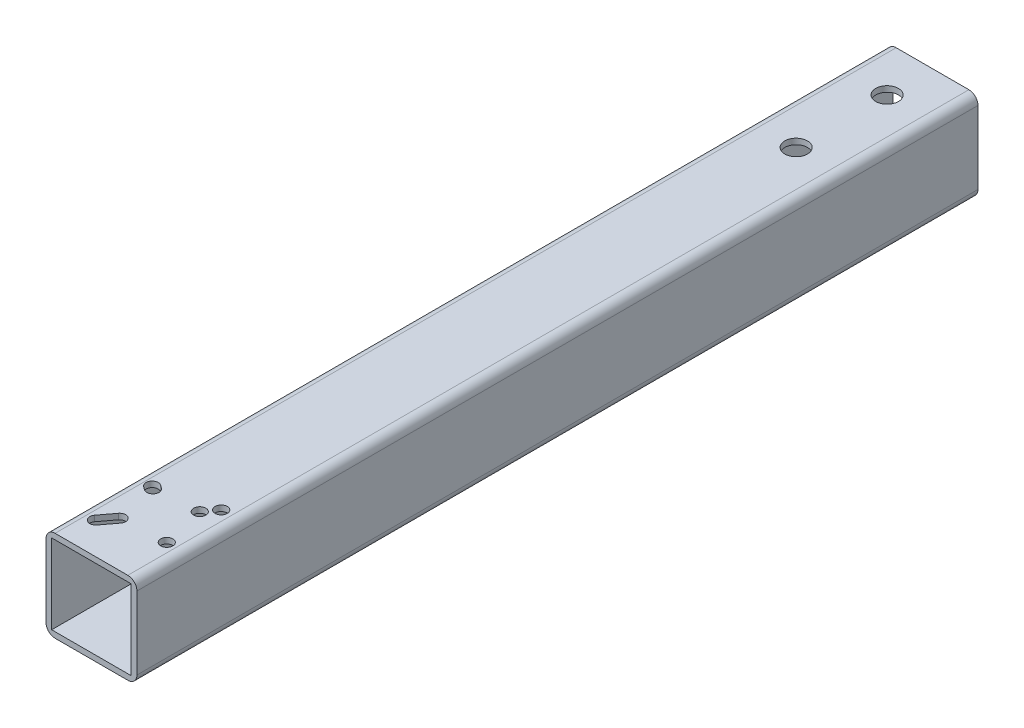
ISO-10303-21;
HEADER;
FILE_DESCRIPTION(('STEP AP214'),'2;1');
FILE_NAME('part.step','',(''),(''),'','','');
FILE_SCHEMA(('AUTOMOTIVE_DESIGN { 1 0 10303 214 1 1 1 1 }'));
ENDSEC;
DATA;
#1=APPLICATION_CONTEXT('core data for automotive mechanical design processes');
#2=APPLICATION_PROTOCOL_DEFINITION('international standard','automotive_design',2000,#1);
#3=PRODUCT_CONTEXT('',#1,'mechanical');
#4=PRODUCT('Part','Part','',(#3));
#5=PRODUCT_RELATED_PRODUCT_CATEGORY('part','',(#4));
#6=PRODUCT_DEFINITION_FORMATION('','',#4);
#7=PRODUCT_DEFINITION_CONTEXT('part definition',#1,'design');
#8=PRODUCT_DEFINITION('design','',#6,#7);
#9=PRODUCT_DEFINITION_SHAPE('','',#8);
#10=(LENGTH_UNIT() NAMED_UNIT(*) SI_UNIT(.MILLI.,.METRE.));
#11=(NAMED_UNIT(*) PLANE_ANGLE_UNIT() SI_UNIT($,.RADIAN.));
#12=(NAMED_UNIT(*) SI_UNIT($,.STERADIAN.) SOLID_ANGLE_UNIT());
#13=UNCERTAINTY_MEASURE_WITH_UNIT(LENGTH_MEASURE(1.E-05),#10,'distance_accuracy_value','');
#14=(GEOMETRIC_REPRESENTATION_CONTEXT(3) GLOBAL_UNCERTAINTY_ASSIGNED_CONTEXT((#13)) GLOBAL_UNIT_ASSIGNED_CONTEXT((#10,
#11,#12)) REPRESENTATION_CONTEXT('',''));
#15=CARTESIAN_POINT('',(0.,0.,0.));
#16=DIRECTION('',(0.,0.,1.));
#17=DIRECTION('',(1.,0.,0.));
#18=AXIS2_PLACEMENT_3D('',#15,#16,#17);
#19=CARTESIAN_POINT('',(0.,0.,234.95));
#20=DIRECTION('',(0.,0.,1.));
#21=DIRECTION('',(1.,0.,0.));
#22=AXIS2_PLACEMENT_3D('',#19,#20,#21);
#23=PLANE('',#22);
#24=DIRECTION('',(1.,0.,0.));
#25=VECTOR('',#24,1.);
#26=CARTESIAN_POINT('',(-24.2595918367347,-13.9751836734694,234.95));
#27=LINE('',#26,#25);
#28=CARTESIAN_POINT('',(-21.7195918367347,-13.9751836734694,234.95));
#29=VERTEX_POINT('',#28);
#30=CARTESIAN_POINT('',(-1.39959183673471,-13.9751836734694,234.95));
#31=VERTEX_POINT('',#30);
#32=EDGE_CURVE('E282',#29,#31,#27,.T.);
#33=ORIENTED_EDGE('',*,*,#32,.T.);
#34=CARTESIAN_POINT('',(-1.3995918367347,-11.4351836734694,234.95));
#35=DIRECTION('',(0.,0.,1.));
#36=DIRECTION('',(1.,0.,0.));
#37=AXIS2_PLACEMENT_3D('',#34,#35,#36);
#38=CIRCLE('',#37,2.54);
#39=CARTESIAN_POINT('',(1.1404081632653,-11.4351836734694,234.95));
#40=VERTEX_POINT('',#39);
#41=EDGE_CURVE('E326',#31,#40,#38,.T.);
#42=ORIENTED_EDGE('',*,*,#41,.T.);
#43=DIRECTION('',(0.,1.,0.));
#44=VECTOR('',#43,1.);
#45=CARTESIAN_POINT('',(1.1404081632653,11.4248163265306,234.95));
#46=LINE('',#45,#44);
#47=CARTESIAN_POINT('',(1.1404081632653,8.88481632653061,234.95));
#48=VERTEX_POINT('',#47);
#49=EDGE_CURVE('E286',#40,#48,#46,.T.);
#50=ORIENTED_EDGE('',*,*,#49,.T.);
#51=CARTESIAN_POINT('',(-1.3995918367347,8.88481632653061,234.95));
#52=DIRECTION('',(0.,0.,1.));
#53=DIRECTION('',(1.,0.,0.));
#54=AXIS2_PLACEMENT_3D('',#51,#52,#53);
#55=CIRCLE('',#54,2.54);
#56=CARTESIAN_POINT('',(-1.3995918367347,11.4248163265306,234.95));
#57=VERTEX_POINT('',#56);
#58=EDGE_CURVE('E320',#48,#57,#55,.T.);
#59=ORIENTED_EDGE('',*,*,#58,.T.);
#60=DIRECTION('',(-1.,0.,0.));
#61=VECTOR('',#60,1.);
#62=CARTESIAN_POINT('',(-24.2595918367347,11.4248163265306,234.95));
#63=LINE('',#62,#61);
#64=CARTESIAN_POINT('',(-21.7195918367347,11.4248163265306,234.95));
#65=VERTEX_POINT('',#64);
#66=EDGE_CURVE('E289',#57,#65,#63,.T.);
#67=ORIENTED_EDGE('',*,*,#66,.T.);
#68=CARTESIAN_POINT('',(-21.7195918367347,8.88481632653061,234.95));
#69=DIRECTION('',(0.,0.,1.));
#70=DIRECTION('',(1.,0.,0.));
#71=AXIS2_PLACEMENT_3D('',#68,#69,#70);
#72=CIRCLE('',#71,2.54);
#73=CARTESIAN_POINT('',(-24.2595918367347,8.88481632653061,234.95));
#74=VERTEX_POINT('',#73);
#75=EDGE_CURVE('E322',#65,#74,#72,.T.);
#76=ORIENTED_EDGE('',*,*,#75,.T.);
#77=DIRECTION('',(0.,-1.,0.));
#78=VECTOR('',#77,1.);
#79=CARTESIAN_POINT('',(-24.2595918367347,11.4248163265306,234.95));
#80=LINE('',#79,#78);
#81=CARTESIAN_POINT('',(-24.2595918367347,-11.4351836734694,234.95));
#82=VERTEX_POINT('',#81);
#83=EDGE_CURVE('E279',#74,#82,#80,.T.);
#84=ORIENTED_EDGE('',*,*,#83,.T.);
#85=CARTESIAN_POINT('',(-21.7195918367347,-11.4351836734694,234.95));
#86=DIRECTION('',(0.,0.,1.));
#87=DIRECTION('',(1.,0.,0.));
#88=AXIS2_PLACEMENT_3D('',#85,#86,#87);
#89=CIRCLE('',#88,2.54);
#90=EDGE_CURVE('E324',#82,#29,#89,.T.);
#91=ORIENTED_EDGE('',*,*,#90,.T.);
#92=EDGE_LOOP('',(#33,#42,#50,#59,#67,#76,#84,#91));
#93=FACE_BOUND('',#92,.T.);
#94=DIRECTION('',(1.,0.,0.));
#95=VECTOR('',#94,1.);
#96=CARTESIAN_POINT('',(-22.6720918367347,-12.3876836734694,234.95));
#97=LINE('',#96,#95);
#98=CARTESIAN_POINT('',(-22.6720918367347,-12.3876836734694,234.95));
#99=VERTEX_POINT('',#98);
#100=CARTESIAN_POINT('',(-0.447091836734699,-12.3876836734694,234.95));
#101=VERTEX_POINT('',#100);
#102=EDGE_CURVE('E250',#99,#101,#97,.T.);
#103=ORIENTED_EDGE('',*,*,#102,.F.);
#104=DIRECTION('',(0.,-1.,0.));
#105=VECTOR('',#104,1.);
#106=CARTESIAN_POINT('',(-22.6720918367347,9.83731632653061,234.95));
#107=LINE('',#106,#105);
#108=CARTESIAN_POINT('',(-22.6720918367347,9.83731632653061,234.95));
#109=VERTEX_POINT('',#108);
#110=EDGE_CURVE('E248',#109,#99,#107,.T.);
#111=ORIENTED_EDGE('',*,*,#110,.F.);
#112=DIRECTION('',(-1.,0.,0.));
#113=VECTOR('',#112,1.);
#114=CARTESIAN_POINT('',(-22.6720918367347,9.83731632653061,234.95));
#115=LINE('',#114,#113);
#116=CARTESIAN_POINT('',(-0.447091836734703,9.83731632653061,234.95));
#117=VERTEX_POINT('',#116);
#118=EDGE_CURVE('E256',#117,#109,#115,.T.);
#119=ORIENTED_EDGE('',*,*,#118,.F.);
#120=DIRECTION('',(0.,1.,0.));
#121=VECTOR('',#120,1.);
#122=CARTESIAN_POINT('',(-0.447091836734703,9.83731632653061,234.95));
#123=LINE('',#122,#121);
#124=EDGE_CURVE('E253',#101,#117,#123,.T.);
#125=ORIENTED_EDGE('',*,*,#124,.F.);
#126=EDGE_LOOP('',(#103,#111,#119,#125));
#127=FACE_BOUND('',#126,.T.);
#128=ADVANCED_FACE('F33',(#93,#127),#23,.T.);
#129=CARTESIAN_POINT('',(0.,0.,0.));
#130=DIRECTION('',(0.,0.,1.));
#131=DIRECTION('',(1.,0.,0.));
#132=AXIS2_PLACEMENT_3D('',#129,#130,#131);
#133=PLANE('',#132);
#134=DIRECTION('',(0.,1.,0.));
#135=VECTOR('',#134,1.);
#136=CARTESIAN_POINT('',(1.1404081632653,11.4248163265306,0.));
#137=LINE('',#136,#135);
#138=CARTESIAN_POINT('',(1.1404081632653,-11.4351836734694,0.));
#139=VERTEX_POINT('',#138);
#140=CARTESIAN_POINT('',(1.1404081632653,8.88481632653061,0.));
#141=VERTEX_POINT('',#140);
#142=EDGE_CURVE('E298',#139,#141,#137,.T.);
#143=ORIENTED_EDGE('',*,*,#142,.F.);
#144=CARTESIAN_POINT('',(-1.3995918367347,-11.4351836734694,0.));
#145=DIRECTION('',(0.,0.,1.));
#146=DIRECTION('',(1.,0.,0.));
#147=AXIS2_PLACEMENT_3D('',#144,#145,#146);
#148=CIRCLE('',#147,2.54);
#149=CARTESIAN_POINT('',(-1.39959183673471,-13.9751836734694,0.));
#150=VERTEX_POINT('',#149);
#151=EDGE_CURVE('E313',#139,#150,#148,.F.);
#152=ORIENTED_EDGE('',*,*,#151,.T.);
#153=DIRECTION('',(1.,0.,0.));
#154=VECTOR('',#153,1.);
#155=CARTESIAN_POINT('',(-24.2595918367347,-13.9751836734694,0.));
#156=LINE('',#155,#154);
#157=CARTESIAN_POINT('',(-21.7195918367347,-13.9751836734694,0.));
#158=VERTEX_POINT('',#157);
#159=EDGE_CURVE('E295',#158,#150,#156,.T.);
#160=ORIENTED_EDGE('',*,*,#159,.F.);
#161=CARTESIAN_POINT('',(-21.7195918367347,-11.4351836734694,0.));
#162=DIRECTION('',(0.,0.,1.));
#163=DIRECTION('',(1.,0.,0.));
#164=AXIS2_PLACEMENT_3D('',#161,#162,#163);
#165=CIRCLE('',#164,2.54);
#166=CARTESIAN_POINT('',(-24.2595918367347,-11.4351836734694,0.));
#167=VERTEX_POINT('',#166);
#168=EDGE_CURVE('E311',#158,#167,#165,.F.);
#169=ORIENTED_EDGE('',*,*,#168,.T.);
#170=DIRECTION('',(0.,-1.,0.));
#171=VECTOR('',#170,1.);
#172=CARTESIAN_POINT('',(-24.2595918367347,11.4248163265306,0.));
#173=LINE('',#172,#171);
#174=CARTESIAN_POINT('',(-24.2595918367347,8.88481632653061,0.));
#175=VERTEX_POINT('',#174);
#176=EDGE_CURVE('E278',#175,#167,#173,.T.);
#177=ORIENTED_EDGE('',*,*,#176,.F.);
#178=CARTESIAN_POINT('',(-21.7195918367347,8.88481632653061,0.));
#179=DIRECTION('',(0.,0.,1.));
#180=DIRECTION('',(1.,0.,0.));
#181=AXIS2_PLACEMENT_3D('',#178,#179,#180);
#182=CIRCLE('',#181,2.54);
#183=CARTESIAN_POINT('',(-21.7195918367347,11.4248163265306,0.));
#184=VERTEX_POINT('',#183);
#185=EDGE_CURVE('E309',#175,#184,#182,.F.);
#186=ORIENTED_EDGE('',*,*,#185,.T.);
#187=DIRECTION('',(-1.,0.,0.));
#188=VECTOR('',#187,1.);
#189=CARTESIAN_POINT('',(-24.2595918367347,11.4248163265306,0.));
#190=LINE('',#189,#188);
#191=CARTESIAN_POINT('',(-1.3995918367347,11.4248163265306,0.));
#192=VERTEX_POINT('',#191);
#193=EDGE_CURVE('E283',#192,#184,#190,.T.);
#194=ORIENTED_EDGE('',*,*,#193,.F.);
#195=CARTESIAN_POINT('',(-1.3995918367347,8.88481632653061,0.));
#196=DIRECTION('',(0.,0.,1.));
#197=DIRECTION('',(1.,0.,0.));
#198=AXIS2_PLACEMENT_3D('',#195,#196,#197);
#199=CIRCLE('',#198,2.54);
#200=EDGE_CURVE('E307',#192,#141,#199,.F.);
#201=ORIENTED_EDGE('',*,*,#200,.T.);
#202=EDGE_LOOP('',(#143,#152,#160,#169,#177,#186,#194,#201));
#203=FACE_BOUND('',#202,.T.);
#204=DIRECTION('',(0.,-1.,0.));
#205=VECTOR('',#204,1.);
#206=CARTESIAN_POINT('',(-22.6720918367347,9.83731632653061,0.));
#207=LINE('',#206,#205);
#208=CARTESIAN_POINT('',(-22.6720918367347,9.83731632653061,0.));
#209=VERTEX_POINT('',#208);
#210=CARTESIAN_POINT('',(-22.6720918367347,-12.3876836734694,0.));
#211=VERTEX_POINT('',#210);
#212=EDGE_CURVE('E247',#209,#211,#207,.T.);
#213=ORIENTED_EDGE('',*,*,#212,.T.);
#214=DIRECTION('',(1.,0.,0.));
#215=VECTOR('',#214,1.);
#216=CARTESIAN_POINT('',(-22.6720918367347,-12.3876836734694,0.));
#217=LINE('',#216,#215);
#218=CARTESIAN_POINT('',(-0.447091836734699,-12.3876836734694,0.));
#219=VERTEX_POINT('',#218);
#220=EDGE_CURVE('E261',#211,#219,#217,.T.);
#221=ORIENTED_EDGE('',*,*,#220,.T.);
#222=DIRECTION('',(0.,1.,0.));
#223=VECTOR('',#222,1.);
#224=CARTESIAN_POINT('',(-0.447091836734703,9.83731632653061,0.));
#225=LINE('',#224,#223);
#226=CARTESIAN_POINT('',(-0.447091836734703,9.83731632653061,0.));
#227=VERTEX_POINT('',#226);
#228=EDGE_CURVE('E264',#219,#227,#225,.T.);
#229=ORIENTED_EDGE('',*,*,#228,.T.);
#230=DIRECTION('',(-1.,0.,0.));
#231=VECTOR('',#230,1.);
#232=CARTESIAN_POINT('',(-22.6720918367347,9.83731632653061,0.));
#233=LINE('',#232,#231);
#234=EDGE_CURVE('E251',#227,#209,#233,.T.);
#235=ORIENTED_EDGE('',*,*,#234,.T.);
#236=EDGE_LOOP('',(#213,#221,#229,#235));
#237=FACE_BOUND('',#236,.T.);
#238=ADVANCED_FACE('F389',(#203,#237),#133,.F.);
#239=CARTESIAN_POINT('',(-24.2595918367347,11.4248163265306,234.95));
#240=DIRECTION('',(1.,0.,0.));
#241=DIRECTION('',(0.,0.,-1.));
#242=AXIS2_PLACEMENT_3D('',#239,#240,#241);
#243=PLANE('',#242);
#244=ORIENTED_EDGE('',*,*,#176,.T.);
#245=DIRECTION('',(0.,0.,-1.));
#246=VECTOR('',#245,1.);
#247=CARTESIAN_POINT('',(-24.2595918367347,-11.4351836734694,234.95));
#248=LINE('',#247,#246);
#249=EDGE_CURVE('E331',#167,#82,#248,.F.);
#250=ORIENTED_EDGE('',*,*,#249,.T.);
#251=ORIENTED_EDGE('',*,*,#83,.F.);
#252=DIRECTION('',(0.,0.,-1.));
#253=VECTOR('',#252,1.);
#254=CARTESIAN_POINT('',(-24.2595918367347,8.88481632653061,234.95));
#255=LINE('',#254,#253);
#256=EDGE_CURVE('E328',#74,#175,#255,.T.);
#257=ORIENTED_EDGE('',*,*,#256,.T.);
#258=EDGE_LOOP('',(#244,#250,#251,#257));
#259=FACE_BOUND('',#258,.T.);
#260=ADVANCED_FACE('F395',(#259),#243,.F.);
#261=CARTESIAN_POINT('',(-24.2595918367347,-13.9751836734694,234.95));
#262=DIRECTION('',(0.,1.,0.));
#263=DIRECTION('',(0.,0.,1.));
#264=AXIS2_PLACEMENT_3D('',#261,#262,#263);
#265=PLANE('',#264);
#266=CARTESIAN_POINT('',(-11.5595918367347,-13.9751836734694,38.1));
#267=DIRECTION('',(0.,1.,0.));
#268=DIRECTION('',(0.,0.,1.));
#269=AXIS2_PLACEMENT_3D('',#266,#267,#268);
#270=CIRCLE('',#269,3.175);
#271=CARTESIAN_POINT('',(-11.5595918367347,-13.9751836734694,41.275));
#272=VERTEX_POINT('',#271);
#273=EDGE_CURVE('E227',#272,#272,#270,.T.);
#274=ORIENTED_EDGE('',*,*,#273,.T.);
#275=EDGE_LOOP('',(#274));
#276=FACE_BOUND('',#275,.T.);
#277=CARTESIAN_POINT('',(-11.5595918367347,-13.9751836734694,12.7));
#278=DIRECTION('',(0.,1.,0.));
#279=DIRECTION('',(0.,0.,1.));
#280=AXIS2_PLACEMENT_3D('',#277,#278,#279);
#281=CIRCLE('',#280,3.175);
#282=CARTESIAN_POINT('',(-11.5595918367347,-13.9751836734694,15.875));
#283=VERTEX_POINT('',#282);
#284=EDGE_CURVE('E238',#283,#283,#281,.T.);
#285=ORIENTED_EDGE('',*,*,#284,.T.);
#286=EDGE_LOOP('',(#285));
#287=FACE_BOUND('',#286,.T.);
#288=ORIENTED_EDGE('',*,*,#159,.T.);
#289=DIRECTION('',(0.,0.,-1.));
#290=VECTOR('',#289,1.);
#291=CARTESIAN_POINT('',(-1.3995918367347,-13.9751836734694,234.95));
#292=LINE('',#291,#290);
#293=EDGE_CURVE('E318',#150,#31,#292,.F.);
#294=ORIENTED_EDGE('',*,*,#293,.T.);
#295=ORIENTED_EDGE('',*,*,#32,.F.);
#296=DIRECTION('',(0.,0.,-1.));
#297=VECTOR('',#296,1.);
#298=CARTESIAN_POINT('',(-21.7195918367347,-13.9751836734694,234.95));
#299=LINE('',#298,#297);
#300=EDGE_CURVE('E315',#29,#158,#299,.T.);
#301=ORIENTED_EDGE('',*,*,#300,.T.);
#302=EDGE_LOOP('',(#288,#294,#295,#301));
#303=FACE_BOUND('',#302,.T.);
#304=ADVANCED_FACE('F384',(#276,#287,#303),#265,.F.);
#305=CARTESIAN_POINT('',(1.1404081632653,11.4248163265306,234.95));
#306=DIRECTION('',(-1.,0.,0.));
#307=DIRECTION('',(0.,-1.,0.));
#308=AXIS2_PLACEMENT_3D('',#305,#306,#307);
#309=PLANE('',#308);
#310=ORIENTED_EDGE('',*,*,#49,.F.);
#311=DIRECTION('',(0.,0.,-1.));
#312=VECTOR('',#311,1.);
#313=CARTESIAN_POINT('',(1.1404081632653,-11.4351836734694,234.95));
#314=LINE('',#313,#312);
#315=EDGE_CURVE('E304',#40,#139,#314,.T.);
#316=ORIENTED_EDGE('',*,*,#315,.T.);
#317=ORIENTED_EDGE('',*,*,#142,.T.);
#318=DIRECTION('',(0.,0.,-1.));
#319=VECTOR('',#318,1.);
#320=CARTESIAN_POINT('',(1.1404081632653,8.88481632653061,234.95));
#321=LINE('',#320,#319);
#322=EDGE_CURVE('E292',#141,#48,#321,.F.);
#323=ORIENTED_EDGE('',*,*,#322,.T.);
#324=EDGE_LOOP('',(#310,#316,#317,#323));
#325=FACE_BOUND('',#324,.T.);
#326=ADVANCED_FACE('F374',(#325),#309,.F.);
#327=CARTESIAN_POINT('',(-24.2595918367347,11.4248163265306,234.95));
#328=DIRECTION('',(0.,-1.,0.));
#329=DIRECTION('',(0.,0.,-1.));
#330=AXIS2_PLACEMENT_3D('',#327,#328,#329);
#331=PLANE('',#330);
#332=CARTESIAN_POINT('',(-4.17214626900218,11.4248163265306,206.096528614339));
#333=DIRECTION('',(0.,1.,0.));
#334=DIRECTION('',(0.,0.,1.));
#335=AXIS2_PLACEMENT_3D('',#332,#333,#334);
#336=CIRCLE('',#335,1.70000000000008);
#337=CARTESIAN_POINT('',(-4.17214626900218,11.4248163265306,207.796528614339));
#338=VERTEX_POINT('',#337);
#339=EDGE_CURVE('E358',#338,#338,#336,.T.);
#340=ORIENTED_EDGE('',*,*,#339,.F.);
#341=EDGE_LOOP('',(#340));
#342=FACE_BOUND('',#341,.T.);
#343=CARTESIAN_POINT('',(-3.92199462296444,11.4248163265306,221.549522882528));
#344=DIRECTION('',(0.,1.,0.));
#345=DIRECTION('',(0.,0.,1.));
#346=AXIS2_PLACEMENT_3D('',#343,#344,#345);
#347=CIRCLE('',#346,1.69999999999997);
#348=CARTESIAN_POINT('',(-3.92199462296444,11.4248163265306,223.249522882528));
#349=VERTEX_POINT('',#348);
#350=EDGE_CURVE('E202',#349,#349,#347,.T.);
#351=ORIENTED_EDGE('',*,*,#350,.F.);
#352=EDGE_LOOP('',(#351));
#353=FACE_BOUND('',#352,.T.);
#354=DIRECTION('',(-0.601815023152074,0.,0.798635510047273));
#355=VECTOR('',#354,1.);
#356=CARTESIAN_POINT('',(-17.7317923890317,11.4248163265306,221.26599854102));
#357=LINE('',#356,#355);
#358=CARTESIAN_POINT('',(-17.7317923890317,11.4248163265306,221.26599854102));
#359=VERTEX_POINT('',#358);
#360=CARTESIAN_POINT('',(-20.5752022148845,11.4248163265306,225.039330826162));
#361=VERTEX_POINT('',#360);
#362=EDGE_CURVE('E188',#359,#361,#357,.T.);
#363=ORIENTED_EDGE('',*,*,#362,.F.);
#364=CARTESIAN_POINT('',(-16.3741120219513,11.4248163265306,222.289084080378));
#365=DIRECTION('',(0.,1.,0.));
#366=DIRECTION('',(0.,0.,1.));
#367=AXIS2_PLACEMENT_3D('',#364,#365,#366);
#368=CIRCLE('',#367,1.70000000000007);
#369=CARTESIAN_POINT('',(-15.0164316548709,11.4248163265306,223.312169619737));
#370=VERTEX_POINT('',#369);
#371=EDGE_CURVE('E50',#370,#359,#368,.T.);
#372=ORIENTED_EDGE('',*,*,#371,.F.);
#373=DIRECTION('',(0.60181502315208,0.,-0.798635510047269));
#374=VECTOR('',#373,1.);
#375=CARTESIAN_POINT('',(-15.0164316548709,11.4248163265306,223.312169619737));
#376=LINE('',#375,#374);
#377=CARTESIAN_POINT('',(-17.8598414807237,11.4248163265306,227.085501904879));
#378=VERTEX_POINT('',#377);
#379=EDGE_CURVE('E195',#378,#370,#376,.T.);
#380=ORIENTED_EDGE('',*,*,#379,.F.);
#381=CARTESIAN_POINT('',(-19.2175218478041,11.4248163265306,226.06241636552));
#382=DIRECTION('',(0.,1.,0.));
#383=DIRECTION('',(0.,0.,1.));
#384=AXIS2_PLACEMENT_3D('',#381,#382,#383);
#385=CIRCLE('',#384,1.70000000000006);
#386=EDGE_CURVE('E178',#361,#378,#385,.T.);
#387=ORIENTED_EDGE('',*,*,#386,.F.);
#388=EDGE_LOOP('',(#363,#372,#380,#387));
#389=FACE_BOUND('',#388,.T.);
#390=DIRECTION('',(0.803957601449502,0.,0.594686619213485));
#391=VECTOR('',#390,1.);
#392=CARTESIAN_POINT('',(-20.6165667647042,11.4248163265306,211.315104237375));
#393=LINE('',#392,#391);
#394=CARTESIAN_POINT('',(-20.6165667647042,11.4248163265306,211.315104237375));
#395=VERTEX_POINT('',#394);
#396=CARTESIAN_POINT('',(-19.7997458416315,11.4248163265306,211.919305842496));
#397=VERTEX_POINT('',#396);
#398=EDGE_CURVE('E206',#395,#397,#393,.T.);
#399=ORIENTED_EDGE('',*,*,#398,.F.);
#400=CARTESIAN_POINT('',(-19.6055995120413,11.4248163265306,209.948376314911));
#401=DIRECTION('',(0.,1.,0.));
#402=DIRECTION('',(0.,0.,1.));
#403=AXIS2_PLACEMENT_3D('',#400,#401,#402);
#404=CIRCLE('',#403,1.70000000000001);
#405=CARTESIAN_POINT('',(-18.5946322593784,11.4248163265306,208.581648392447));
#406=VERTEX_POINT('',#405);
#407=EDGE_CURVE('E58',#406,#395,#404,.T.);
#408=ORIENTED_EDGE('',*,*,#407,.F.);
#409=DIRECTION('',(-0.803957601449443,0.,-0.594686619213564));
#410=VECTOR('',#409,1.);
#411=CARTESIAN_POINT('',(-18.5946322593784,11.4248163265306,208.581648392447));
#412=LINE('',#411,#410);
#413=CARTESIAN_POINT('',(-17.7778113363057,11.4248163265306,209.185849997568));
#414=VERTEX_POINT('',#413);
#415=EDGE_CURVE('E212',#414,#406,#412,.T.);
#416=ORIENTED_EDGE('',*,*,#415,.F.);
#417=CARTESIAN_POINT('',(-18.7887785889686,11.4248163265306,210.552577920032));
#418=DIRECTION('',(0.,1.,0.));
#419=DIRECTION('',(0.,0.,1.));
#420=AXIS2_PLACEMENT_3D('',#417,#418,#419);
#421=CIRCLE('',#420,1.69999999999996);
#422=EDGE_CURVE('E209',#397,#414,#421,.T.);
#423=ORIENTED_EDGE('',*,*,#422,.F.);
#424=EDGE_LOOP('',(#399,#408,#416,#423));
#425=FACE_BOUND('',#424,.T.);
#426=CARTESIAN_POINT('',(-6.74507165151809,11.4248163265306,209.510915919622));
#427=DIRECTION('',(0.,1.,0.));
#428=DIRECTION('',(0.,0.,1.));
#429=AXIS2_PLACEMENT_3D('',#426,#427,#428);
#430=CIRCLE('',#429,1.70000000000005);
#431=CARTESIAN_POINT('',(-6.74507165151809,11.4248163265306,211.210915919622));
#432=VERTEX_POINT('',#431);
#433=EDGE_CURVE('E223',#432,#432,#430,.T.);
#434=ORIENTED_EDGE('',*,*,#433,.F.);
#435=EDGE_LOOP('',(#434));
#436=FACE_BOUND('',#435,.T.);
#437=CARTESIAN_POINT('',(-11.5595918367347,11.4248163265306,38.1));
#438=DIRECTION('',(0.,1.,0.));
#439=DIRECTION('',(0.,0.,1.));
#440=AXIS2_PLACEMENT_3D('',#437,#438,#439);
#441=CIRCLE('',#440,3.175);
#442=CARTESIAN_POINT('',(-11.5595918367347,11.4248163265306,41.275));
#443=VERTEX_POINT('',#442);
#444=EDGE_CURVE('E231',#443,#443,#441,.T.);
#445=ORIENTED_EDGE('',*,*,#444,.F.);
#446=EDGE_LOOP('',(#445));
#447=FACE_BOUND('',#446,.T.);
#448=CARTESIAN_POINT('',(-11.5595918367347,11.4248163265306,12.7));
#449=DIRECTION('',(0.,1.,0.));
#450=DIRECTION('',(0.,0.,1.));
#451=AXIS2_PLACEMENT_3D('',#448,#449,#450);
#452=CIRCLE('',#451,3.175);
#453=CARTESIAN_POINT('',(-11.5595918367347,11.4248163265306,15.875));
#454=VERTEX_POINT('',#453);
#455=EDGE_CURVE('E237',#454,#454,#452,.T.);
#456=ORIENTED_EDGE('',*,*,#455,.F.);
#457=EDGE_LOOP('',(#456));
#458=FACE_BOUND('',#457,.T.);
#459=ORIENTED_EDGE('',*,*,#193,.T.);
#460=DIRECTION('',(0.,0.,-1.));
#461=VECTOR('',#460,1.);
#462=CARTESIAN_POINT('',(-21.7195918367347,11.4248163265306,234.95));
#463=LINE('',#462,#461);
#464=EDGE_CURVE('E336',#184,#65,#463,.F.);
#465=ORIENTED_EDGE('',*,*,#464,.T.);
#466=ORIENTED_EDGE('',*,*,#66,.F.);
#467=DIRECTION('',(0.,0.,-1.));
#468=VECTOR('',#467,1.);
#469=CARTESIAN_POINT('',(-1.3995918367347,11.4248163265306,234.95));
#470=LINE('',#469,#468);
#471=EDGE_CURVE('E333',#57,#192,#470,.T.);
#472=ORIENTED_EDGE('',*,*,#471,.T.);
#473=EDGE_LOOP('',(#459,#465,#466,#472));
#474=FACE_BOUND('',#473,.T.);
#475=ADVANCED_FACE('F192',(#342,#353,#389,#425,#436,#447,#458,#474),#331,.F.);
#476=CARTESIAN_POINT('',(-22.6720918367347,9.83731632653061,234.95));
#477=DIRECTION('',(1.,0.,0.));
#478=DIRECTION('',(0.,1.,0.));
#479=AXIS2_PLACEMENT_3D('',#476,#477,#478);
#480=PLANE('',#479);
#481=ORIENTED_EDGE('',*,*,#212,.F.);
#482=DIRECTION('',(0.,0.,-1.));
#483=VECTOR('',#482,1.);
#484=CARTESIAN_POINT('',(-22.6720918367347,9.83731632653061,234.95));
#485=LINE('',#484,#483);
#486=EDGE_CURVE('E258',#109,#209,#485,.T.);
#487=ORIENTED_EDGE('',*,*,#486,.F.);
#488=ORIENTED_EDGE('',*,*,#110,.T.);
#489=DIRECTION('',(0.,0.,-1.));
#490=VECTOR('',#489,1.);
#491=CARTESIAN_POINT('',(-22.6720918367347,-12.3876836734694,234.95));
#492=LINE('',#491,#490);
#493=EDGE_CURVE('E275',#99,#211,#492,.T.);
#494=ORIENTED_EDGE('',*,*,#493,.T.);
#495=EDGE_LOOP('',(#481,#487,#488,#494));
#496=FACE_BOUND('',#495,.T.);
#497=ADVANCED_FACE('F373',(#496),#480,.T.);
#498=CARTESIAN_POINT('',(-22.6720918367347,-12.3876836734694,234.95));
#499=DIRECTION('',(0.,1.,0.));
#500=DIRECTION('',(0.,0.,1.));
#501=AXIS2_PLACEMENT_3D('',#498,#499,#500);
#502=PLANE('',#501);
#503=CARTESIAN_POINT('',(-11.5595918367347,-12.3876836734694,38.1));
#504=DIRECTION('',(0.,1.,0.));
#505=DIRECTION('',(0.,0.,1.));
#506=AXIS2_PLACEMENT_3D('',#503,#504,#505);
#507=CIRCLE('',#506,3.175);
#508=CARTESIAN_POINT('',(-11.5595918367347,-12.3876836734694,41.275));
#509=VERTEX_POINT('',#508);
#510=EDGE_CURVE('E234',#509,#509,#507,.T.);
#511=ORIENTED_EDGE('',*,*,#510,.F.);
#512=EDGE_LOOP('',(#511));
#513=FACE_BOUND('',#512,.T.);
#514=CARTESIAN_POINT('',(-11.5595918367347,-12.3876836734694,12.7));
#515=DIRECTION('',(0.,1.,0.));
#516=DIRECTION('',(0.,0.,1.));
#517=AXIS2_PLACEMENT_3D('',#514,#515,#516);
#518=CIRCLE('',#517,3.175);
#519=CARTESIAN_POINT('',(-11.5595918367347,-12.3876836734694,15.875));
#520=VERTEX_POINT('',#519);
#521=EDGE_CURVE('E244',#520,#520,#518,.T.);
#522=ORIENTED_EDGE('',*,*,#521,.F.);
#523=EDGE_LOOP('',(#522));
#524=FACE_BOUND('',#523,.T.);
#525=ORIENTED_EDGE('',*,*,#220,.F.);
#526=ORIENTED_EDGE('',*,*,#493,.F.);
#527=ORIENTED_EDGE('',*,*,#102,.T.);
#528=DIRECTION('',(0.,0.,-1.));
#529=VECTOR('',#528,1.);
#530=CARTESIAN_POINT('',(-0.447091836734699,-12.3876836734694,234.95));
#531=LINE('',#530,#529);
#532=EDGE_CURVE('E273',#101,#219,#531,.T.);
#533=ORIENTED_EDGE('',*,*,#532,.T.);
#534=EDGE_LOOP('',(#525,#526,#527,#533));
#535=FACE_BOUND('',#534,.T.);
#536=ADVANCED_FACE('F381',(#513,#524,#535),#502,.T.);
#537=CARTESIAN_POINT('',(-0.447091836734703,9.83731632653061,234.95));
#538=DIRECTION('',(-1.,0.,0.));
#539=DIRECTION('',(0.,-1.,0.));
#540=AXIS2_PLACEMENT_3D('',#537,#538,#539);
#541=PLANE('',#540);
#542=ORIENTED_EDGE('',*,*,#228,.F.);
#543=ORIENTED_EDGE('',*,*,#532,.F.);
#544=ORIENTED_EDGE('',*,*,#124,.T.);
#545=DIRECTION('',(0.,0.,-1.));
#546=VECTOR('',#545,1.);
#547=CARTESIAN_POINT('',(-0.447091836734703,9.83731632653061,234.95));
#548=LINE('',#547,#546);
#549=EDGE_CURVE('E271',#117,#227,#548,.T.);
#550=ORIENTED_EDGE('',*,*,#549,.T.);
#551=EDGE_LOOP('',(#542,#543,#544,#550));
#552=FACE_BOUND('',#551,.T.);
#553=ADVANCED_FACE('F401',(#552),#541,.T.);
#554=CARTESIAN_POINT('',(-22.6720918367347,9.83731632653061,234.95));
#555=DIRECTION('',(0.,-1.,0.));
#556=DIRECTION('',(0.,0.,-1.));
#557=AXIS2_PLACEMENT_3D('',#554,#555,#556);
#558=PLANE('',#557);
#559=CARTESIAN_POINT('',(-4.17214626900218,9.83731632653061,206.096528614339));
#560=DIRECTION('',(0.,-1.,0.));
#561=DIRECTION('',(0.,0.,-1.));
#562=AXIS2_PLACEMENT_3D('',#559,#560,#561);
#563=CIRCLE('',#562,1.70000000000008);
#564=CARTESIAN_POINT('',(-4.17214626900218,9.83731632653061,204.396528614339));
#565=VERTEX_POINT('',#564);
#566=EDGE_CURVE('E37',#565,#565,#563,.T.);
#567=ORIENTED_EDGE('',*,*,#566,.F.);
#568=EDGE_LOOP('',(#567));
#569=FACE_BOUND('',#568,.T.);
#570=CARTESIAN_POINT('',(-3.92199462296444,9.83731632653061,221.549522882528));
#571=DIRECTION('',(0.,-1.,0.));
#572=DIRECTION('',(0.,0.,-1.));
#573=AXIS2_PLACEMENT_3D('',#570,#571,#572);
#574=CIRCLE('',#573,1.69999999999997);
#575=CARTESIAN_POINT('',(-3.92199462296444,9.83731632653061,219.849522882528));
#576=VERTEX_POINT('',#575);
#577=EDGE_CURVE('E356',#576,#576,#574,.T.);
#578=ORIENTED_EDGE('',*,*,#577,.F.);
#579=EDGE_LOOP('',(#578));
#580=FACE_BOUND('',#579,.T.);
#581=CARTESIAN_POINT('',(-16.3741120219513,9.83731632653061,222.289084080378));
#582=DIRECTION('',(0.,-1.,0.));
#583=DIRECTION('',(0.,0.,-1.));
#584=AXIS2_PLACEMENT_3D('',#581,#582,#583);
#585=CIRCLE('',#584,1.70000000000007);
#586=CARTESIAN_POINT('',(-17.7317923890317,9.83731632653061,221.26599854102));
#587=VERTEX_POINT('',#586);
#588=CARTESIAN_POINT('',(-15.0164316548709,9.83731632653061,223.312169619737));
#589=VERTEX_POINT('',#588);
#590=EDGE_CURVE('E11',#587,#589,#585,.T.);
#591=ORIENTED_EDGE('',*,*,#590,.F.);
#592=DIRECTION('',(0.601815023152074,0.,-0.798635510047273));
#593=VECTOR('',#592,1.);
#594=CARTESIAN_POINT('',(-26.09802979937,9.83731632653061,232.368370572855));
#595=LINE('',#594,#593);
#596=CARTESIAN_POINT('',(-20.5752022148845,9.83731632653061,225.039330826162));
#597=VERTEX_POINT('',#596);
#598=EDGE_CURVE('E353',#597,#587,#595,.T.);
#599=ORIENTED_EDGE('',*,*,#598,.F.);
#600=CARTESIAN_POINT('',(-19.2175218478041,9.83731632653061,226.06241636552));
#601=DIRECTION('',(0.,-1.,0.));
#602=DIRECTION('',(0.,0.,-1.));
#603=AXIS2_PLACEMENT_3D('',#600,#601,#602);
#604=CIRCLE('',#603,1.70000000000006);
#605=CARTESIAN_POINT('',(-17.8598414807237,9.83731632653061,227.085501904879));
#606=VERTEX_POINT('',#605);
#607=EDGE_CURVE('E181',#606,#597,#604,.T.);
#608=ORIENTED_EDGE('',*,*,#607,.F.);
#609=DIRECTION('',(-0.60181502315208,0.,0.798635510047269));
#610=VECTOR('',#609,1.);
#611=CARTESIAN_POINT('',(-23.3826690652092,9.83731632653061,234.414541651572));
#612=LINE('',#611,#610);
#613=EDGE_CURVE('E42',#589,#606,#612,.T.);
#614=ORIENTED_EDGE('',*,*,#613,.F.);
#615=EDGE_LOOP('',(#591,#599,#608,#614));
#616=FACE_BOUND('',#615,.T.);
#617=CARTESIAN_POINT('',(-19.6055995120413,9.83731632653061,209.948376314911));
#618=DIRECTION('',(0.,-1.,0.));
#619=DIRECTION('',(0.,0.,-1.));
#620=AXIS2_PLACEMENT_3D('',#617,#618,#619);
#621=CIRCLE('',#620,1.70000000000001);
#622=CARTESIAN_POINT('',(-20.6165667647042,9.83731632653061,211.315104237375));
#623=VERTEX_POINT('',#622);
#624=CARTESIAN_POINT('',(-18.5946322593784,9.83731632653061,208.581648392447));
#625=VERTEX_POINT('',#624);
#626=EDGE_CURVE('E351',#623,#625,#621,.T.);
#627=ORIENTED_EDGE('',*,*,#626,.F.);
#628=DIRECTION('',(-0.803957601449502,0.,-0.594686619213485));
#629=VECTOR('',#628,1.);
#630=CARTESIAN_POINT('',(-10.6452404205722,9.83731632653061,218.690884181461));
#631=LINE('',#630,#629);
#632=CARTESIAN_POINT('',(-19.7997458416315,9.83731632653061,211.919305842496));
#633=VERTEX_POINT('',#632);
#634=EDGE_CURVE('E338',#633,#623,#631,.T.);
#635=ORIENTED_EDGE('',*,*,#634,.F.);
#636=CARTESIAN_POINT('',(-18.7887785889686,9.83731632653061,210.552577920032));
#637=DIRECTION('',(0.,-1.,0.));
#638=DIRECTION('',(0.,0.,-1.));
#639=AXIS2_PLACEMENT_3D('',#636,#637,#638);
#640=CIRCLE('',#639,1.69999999999996);
#641=CARTESIAN_POINT('',(-17.7778113363057,9.83731632653061,209.185849997568));
#642=VERTEX_POINT('',#641);
#643=EDGE_CURVE('E346',#642,#633,#640,.T.);
#644=ORIENTED_EDGE('',*,*,#643,.F.);
#645=DIRECTION('',(0.803957601449443,0.,0.594686619213564));
#646=VECTOR('',#645,1.);
#647=CARTESIAN_POINT('',(-8.62330591524523,9.83731632653061,215.957428336535));
#648=LINE('',#647,#646);
#649=EDGE_CURVE('E349',#625,#642,#648,.T.);
#650=ORIENTED_EDGE('',*,*,#649,.F.);
#651=EDGE_LOOP('',(#627,#635,#644,#650));
#652=FACE_BOUND('',#651,.T.);
#653=CARTESIAN_POINT('',(-6.74507165151809,9.83731632653061,209.510915919622));
#654=DIRECTION('',(0.,-1.,0.));
#655=DIRECTION('',(0.,0.,-1.));
#656=AXIS2_PLACEMENT_3D('',#653,#654,#655);
#657=CIRCLE('',#656,1.70000000000005);
#658=CARTESIAN_POINT('',(-6.74507165151809,9.83731632653061,207.810915919622));
#659=VERTEX_POINT('',#658);
#660=EDGE_CURVE('E226',#659,#659,#657,.T.);
#661=ORIENTED_EDGE('',*,*,#660,.F.);
#662=EDGE_LOOP('',(#661));
#663=FACE_BOUND('',#662,.T.);
#664=CARTESIAN_POINT('',(-11.5595918367347,9.83731632653062,38.1));
#665=DIRECTION('',(0.,-1.,0.));
#666=DIRECTION('',(0.,0.,-1.));
#667=AXIS2_PLACEMENT_3D('',#664,#665,#666);
#668=CIRCLE('',#667,3.175);
#669=CARTESIAN_POINT('',(-11.5595918367347,9.83731632653062,34.925));
#670=VERTEX_POINT('',#669);
#671=EDGE_CURVE('E230',#670,#670,#668,.T.);
#672=ORIENTED_EDGE('',*,*,#671,.F.);
#673=EDGE_LOOP('',(#672));
#674=FACE_BOUND('',#673,.T.);
#675=CARTESIAN_POINT('',(-11.5595918367347,9.83731632653062,12.7));
#676=DIRECTION('',(0.,-1.,0.));
#677=DIRECTION('',(0.,0.,-1.));
#678=AXIS2_PLACEMENT_3D('',#675,#676,#677);
#679=CIRCLE('',#678,3.175);
#680=CARTESIAN_POINT('',(-11.5595918367347,9.83731632653062,9.525));
#681=VERTEX_POINT('',#680);
#682=EDGE_CURVE('E241',#681,#681,#679,.T.);
#683=ORIENTED_EDGE('',*,*,#682,.F.);
#684=EDGE_LOOP('',(#683));
#685=FACE_BOUND('',#684,.T.);
#686=ORIENTED_EDGE('',*,*,#234,.F.);
#687=ORIENTED_EDGE('',*,*,#549,.F.);
#688=ORIENTED_EDGE('',*,*,#118,.T.);
#689=ORIENTED_EDGE('',*,*,#486,.T.);
#690=EDGE_LOOP('',(#686,#687,#688,#689));
#691=FACE_BOUND('',#690,.T.);
#692=ADVANCED_FACE('F405',(#569,#580,#616,#652,#663,#674,#685,#691),#558,.T.);
#693=CARTESIAN_POINT('',(-1.3995918367347,-11.4351836734694,234.95));
#694=DIRECTION('',(0.,0.,-1.));
#695=DIRECTION('',(-1.,0.,0.));
#696=AXIS2_PLACEMENT_3D('',#693,#694,#695);
#697=CYLINDRICAL_SURFACE('',#696,2.54);
#698=ORIENTED_EDGE('',*,*,#41,.F.);
#699=ORIENTED_EDGE('',*,*,#293,.F.);
#700=ORIENTED_EDGE('',*,*,#151,.F.);
#701=ORIENTED_EDGE('',*,*,#315,.F.);
#702=EDGE_LOOP('',(#698,#699,#700,#701));
#703=FACE_BOUND('',#702,.T.);
#704=ADVANCED_FACE('F409',(#703),#697,.T.);
#705=CARTESIAN_POINT('',(-21.7195918367347,-11.4351836734694,234.95));
#706=DIRECTION('',(0.,0.,-1.));
#707=DIRECTION('',(-1.,0.,0.));
#708=AXIS2_PLACEMENT_3D('',#705,#706,#707);
#709=CYLINDRICAL_SURFACE('',#708,2.54);
#710=ORIENTED_EDGE('',*,*,#90,.F.);
#711=ORIENTED_EDGE('',*,*,#249,.F.);
#712=ORIENTED_EDGE('',*,*,#168,.F.);
#713=ORIENTED_EDGE('',*,*,#300,.F.);
#714=EDGE_LOOP('',(#710,#711,#712,#713));
#715=FACE_BOUND('',#714,.T.);
#716=ADVANCED_FACE('F503',(#715),#709,.T.);
#717=CARTESIAN_POINT('',(-21.7195918367347,8.88481632653061,234.95));
#718=DIRECTION('',(0.,0.,-1.));
#719=DIRECTION('',(-1.,0.,0.));
#720=AXIS2_PLACEMENT_3D('',#717,#718,#719);
#721=CYLINDRICAL_SURFACE('',#720,2.54);
#722=ORIENTED_EDGE('',*,*,#75,.F.);
#723=ORIENTED_EDGE('',*,*,#464,.F.);
#724=ORIENTED_EDGE('',*,*,#185,.F.);
#725=ORIENTED_EDGE('',*,*,#256,.F.);
#726=EDGE_LOOP('',(#722,#723,#724,#725));
#727=FACE_BOUND('',#726,.T.);
#728=ADVANCED_FACE('F495',(#727),#721,.T.);
#729=CARTESIAN_POINT('',(-1.3995918367347,8.88481632653061,234.95));
#730=DIRECTION('',(0.,0.,-1.));
#731=DIRECTION('',(-1.,0.,0.));
#732=AXIS2_PLACEMENT_3D('',#729,#730,#731);
#733=CYLINDRICAL_SURFACE('',#732,2.54);
#734=ORIENTED_EDGE('',*,*,#58,.F.);
#735=ORIENTED_EDGE('',*,*,#322,.F.);
#736=ORIENTED_EDGE('',*,*,#200,.F.);
#737=ORIENTED_EDGE('',*,*,#471,.F.);
#738=EDGE_LOOP('',(#734,#735,#736,#737));
#739=FACE_BOUND('',#738,.T.);
#740=ADVANCED_FACE('F35',(#739),#733,.T.);
#741=CARTESIAN_POINT('',(-11.5595918367347,-13.9751836734694,12.7));
#742=DIRECTION('',(0.,1.,0.));
#743=DIRECTION('',(0.,0.,1.));
#744=AXIS2_PLACEMENT_3D('',#741,#742,#743);
#745=CYLINDRICAL_SURFACE('',#744,3.175);
#746=ORIENTED_EDGE('',*,*,#682,.T.);
#747=EDGE_LOOP('',(#746));
#748=FACE_BOUND('',#747,.T.);
#749=ORIENTED_EDGE('',*,*,#455,.T.);
#750=EDGE_LOOP('',(#749));
#751=FACE_BOUND('',#750,.T.);
#752=ADVANCED_FACE('F411',(#748,#751),#745,.F.);
#753=ORIENTED_EDGE('',*,*,#521,.T.);
#754=EDGE_LOOP('',(#753));
#755=FACE_BOUND('',#754,.T.);
#756=ORIENTED_EDGE('',*,*,#284,.F.);
#757=EDGE_LOOP('',(#756));
#758=FACE_BOUND('',#757,.T.);
#759=ADVANCED_FACE('F414',(#755,#758),#745,.F.);
#760=CARTESIAN_POINT('',(-11.5595918367347,-13.9751836734694,38.1));
#761=DIRECTION('',(0.,1.,0.));
#762=DIRECTION('',(0.,0.,1.));
#763=AXIS2_PLACEMENT_3D('',#760,#761,#762);
#764=CYLINDRICAL_SURFACE('',#763,3.175);
#765=ORIENTED_EDGE('',*,*,#671,.T.);
#766=EDGE_LOOP('',(#765));
#767=FACE_BOUND('',#766,.T.);
#768=ORIENTED_EDGE('',*,*,#444,.T.);
#769=EDGE_LOOP('',(#768));
#770=FACE_BOUND('',#769,.T.);
#771=ADVANCED_FACE('F416',(#767,#770),#764,.F.);
#772=ORIENTED_EDGE('',*,*,#510,.T.);
#773=EDGE_LOOP('',(#772));
#774=FACE_BOUND('',#773,.T.);
#775=ORIENTED_EDGE('',*,*,#273,.F.);
#776=EDGE_LOOP('',(#775));
#777=FACE_BOUND('',#776,.T.);
#778=ADVANCED_FACE('F419',(#774,#777),#764,.F.);
#779=CARTESIAN_POINT('',(-6.74507165151809,8.88481632653061,209.510915919622));
#780=DIRECTION('',(0.,1.,0.));
#781=DIRECTION('',(0.,0.,1.));
#782=AXIS2_PLACEMENT_3D('',#779,#780,#781);
#783=CYLINDRICAL_SURFACE('',#782,1.70000000000005);
#784=ORIENTED_EDGE('',*,*,#660,.T.);
#785=EDGE_LOOP('',(#784));
#786=FACE_BOUND('',#785,.T.);
#787=ORIENTED_EDGE('',*,*,#433,.T.);
#788=EDGE_LOOP('',(#787));
#789=FACE_BOUND('',#788,.T.);
#790=ADVANCED_FACE('F421',(#786,#789),#783,.F.);
#791=CARTESIAN_POINT('',(-19.6055995120413,8.88481632653061,209.948376314911));
#792=DIRECTION('',(0.,1.,0.));
#793=DIRECTION('',(0.,0.,1.));
#794=AXIS2_PLACEMENT_3D('',#791,#792,#793);
#795=CYLINDRICAL_SURFACE('',#794,1.70000000000001);
#796=ORIENTED_EDGE('',*,*,#626,.T.);
#797=DIRECTION('',(0.,1.,0.));
#798=VECTOR('',#797,1.);
#799=CARTESIAN_POINT('',(-18.5946322593784,8.88481632653061,208.581648392447));
#800=LINE('',#799,#798);
#801=EDGE_CURVE('E216',#625,#406,#800,.T.);
#802=ORIENTED_EDGE('',*,*,#801,.T.);
#803=ORIENTED_EDGE('',*,*,#407,.T.);
#804=DIRECTION('',(0.,1.,0.));
#805=VECTOR('',#804,1.);
#806=CARTESIAN_POINT('',(-20.6165667647042,8.88481632653061,211.315104237375));
#807=LINE('',#806,#805);
#808=EDGE_CURVE('E215',#623,#395,#807,.T.);
#809=ORIENTED_EDGE('',*,*,#808,.F.);
#810=EDGE_LOOP('',(#796,#802,#803,#809));
#811=FACE_BOUND('',#810,.T.);
#812=ADVANCED_FACE('F424',(#811),#795,.F.);
#813=CARTESIAN_POINT('',(-18.5946322593784,8.88481632653061,208.581648392447));
#814=DIRECTION('',(0.594686619213564,0.,-0.803957601449443));
#815=DIRECTION('',(-0.803957601449443,0.,-0.594686619213564));
#816=AXIS2_PLACEMENT_3D('',#813,#814,#815);
#817=PLANE('',#816);
#818=ORIENTED_EDGE('',*,*,#649,.T.);
#819=DIRECTION('',(0.,1.,0.));
#820=VECTOR('',#819,1.);
#821=CARTESIAN_POINT('',(-17.7778113363057,8.88481632653061,209.185849997568));
#822=LINE('',#821,#820);
#823=EDGE_CURVE('E218',#642,#414,#822,.T.);
#824=ORIENTED_EDGE('',*,*,#823,.T.);
#825=ORIENTED_EDGE('',*,*,#415,.T.);
#826=ORIENTED_EDGE('',*,*,#801,.F.);
#827=EDGE_LOOP('',(#818,#824,#825,#826));
#828=FACE_BOUND('',#827,.T.);
#829=ADVANCED_FACE('F428',(#828),#817,.F.);
#830=CARTESIAN_POINT('',(-18.7887785889686,8.88481632653061,210.552577920032));
#831=DIRECTION('',(0.,1.,0.));
#832=DIRECTION('',(0.,0.,1.));
#833=AXIS2_PLACEMENT_3D('',#830,#831,#832);
#834=CYLINDRICAL_SURFACE('',#833,1.69999999999996);
#835=ORIENTED_EDGE('',*,*,#643,.T.);
#836=DIRECTION('',(0.,1.,0.));
#837=VECTOR('',#836,1.);
#838=CARTESIAN_POINT('',(-19.7997458416315,8.88481632653061,211.919305842496));
#839=LINE('',#838,#837);
#840=EDGE_CURVE('E220',#633,#397,#839,.T.);
#841=ORIENTED_EDGE('',*,*,#840,.T.);
#842=ORIENTED_EDGE('',*,*,#422,.T.);
#843=ORIENTED_EDGE('',*,*,#823,.F.);
#844=EDGE_LOOP('',(#835,#841,#842,#843));
#845=FACE_BOUND('',#844,.T.);
#846=ADVANCED_FACE('F433',(#845),#834,.F.);
#847=CARTESIAN_POINT('',(-20.6165667647042,8.88481632653061,211.315104237375));
#848=DIRECTION('',(-0.594686619213485,0.,0.803957601449502));
#849=DIRECTION('',(0.803957601449502,0.,0.594686619213485));
#850=AXIS2_PLACEMENT_3D('',#847,#848,#849);
#851=PLANE('',#850);
#852=ORIENTED_EDGE('',*,*,#634,.T.);
#853=ORIENTED_EDGE('',*,*,#808,.T.);
#854=ORIENTED_EDGE('',*,*,#398,.T.);
#855=ORIENTED_EDGE('',*,*,#840,.F.);
#856=EDGE_LOOP('',(#852,#853,#854,#855));
#857=FACE_BOUND('',#856,.T.);
#858=ADVANCED_FACE('F429',(#857),#851,.F.);
#859=CARTESIAN_POINT('',(-16.3741120219513,8.88481632653061,222.289084080378));
#860=DIRECTION('',(0.,1.,0.));
#861=DIRECTION('',(0.,0.,1.));
#862=AXIS2_PLACEMENT_3D('',#859,#860,#861);
#863=CYLINDRICAL_SURFACE('',#862,1.70000000000007);
#864=ORIENTED_EDGE('',*,*,#590,.T.);
#865=DIRECTION('',(0.,1.,0.));
#866=VECTOR('',#865,1.);
#867=CARTESIAN_POINT('',(-15.0164316548709,8.88481632653061,223.312169619737));
#868=LINE('',#867,#866);
#869=EDGE_CURVE('E200',#589,#370,#868,.T.);
#870=ORIENTED_EDGE('',*,*,#869,.T.);
#871=ORIENTED_EDGE('',*,*,#371,.T.);
#872=DIRECTION('',(0.,1.,0.));
#873=VECTOR('',#872,1.);
#874=CARTESIAN_POINT('',(-17.7317923890317,8.88481632653061,221.26599854102));
#875=LINE('',#874,#873);
#876=EDGE_CURVE('E185',#587,#359,#875,.T.);
#877=ORIENTED_EDGE('',*,*,#876,.F.);
#878=EDGE_LOOP('',(#864,#870,#871,#877));
#879=FACE_BOUND('',#878,.T.);
#880=ADVANCED_FACE('F432',(#879),#863,.F.);
#881=CARTESIAN_POINT('',(-15.0164316548709,8.88481632653061,223.312169619737));
#882=DIRECTION('',(0.798635510047269,0.,0.60181502315208));
#883=DIRECTION('',(0.60181502315208,0.,-0.798635510047269));
#884=AXIS2_PLACEMENT_3D('',#881,#882,#883);
#885=PLANE('',#884);
#886=ORIENTED_EDGE('',*,*,#613,.T.);
#887=DIRECTION('',(0.,1.,0.));
#888=VECTOR('',#887,1.);
#889=CARTESIAN_POINT('',(-17.8598414807237,8.88481632653061,227.085501904879));
#890=LINE('',#889,#888);
#891=EDGE_CURVE('E184',#606,#378,#890,.T.);
#892=ORIENTED_EDGE('',*,*,#891,.T.);
#893=ORIENTED_EDGE('',*,*,#379,.T.);
#894=ORIENTED_EDGE('',*,*,#869,.F.);
#895=EDGE_LOOP('',(#886,#892,#893,#894));
#896=FACE_BOUND('',#895,.T.);
#897=ADVANCED_FACE('F443',(#896),#885,.F.);
#898=CARTESIAN_POINT('',(-19.2175218478041,8.88481632653061,226.06241636552));
#899=DIRECTION('',(0.,1.,0.));
#900=DIRECTION('',(0.,0.,1.));
#901=AXIS2_PLACEMENT_3D('',#898,#899,#900);
#902=CYLINDRICAL_SURFACE('',#901,1.70000000000006);
#903=ORIENTED_EDGE('',*,*,#607,.T.);
#904=DIRECTION('',(0.,1.,0.));
#905=VECTOR('',#904,1.);
#906=CARTESIAN_POINT('',(-20.5752022148845,8.88481632653061,225.039330826162));
#907=LINE('',#906,#905);
#908=EDGE_CURVE('E173',#597,#361,#907,.T.);
#909=ORIENTED_EDGE('',*,*,#908,.T.);
#910=ORIENTED_EDGE('',*,*,#386,.T.);
#911=ORIENTED_EDGE('',*,*,#891,.F.);
#912=EDGE_LOOP('',(#903,#909,#910,#911));
#913=FACE_BOUND('',#912,.T.);
#914=ADVANCED_FACE('F175',(#913),#902,.F.);
#915=CARTESIAN_POINT('',(-17.7317923890317,8.88481632653061,221.26599854102));
#916=DIRECTION('',(-0.798635510047273,0.,-0.601815023152074));
#917=DIRECTION('',(-0.601815023152074,0.,0.798635510047273));
#918=AXIS2_PLACEMENT_3D('',#915,#916,#917);
#919=PLANE('',#918);
#920=ORIENTED_EDGE('',*,*,#598,.T.);
#921=ORIENTED_EDGE('',*,*,#876,.T.);
#922=ORIENTED_EDGE('',*,*,#362,.T.);
#923=ORIENTED_EDGE('',*,*,#908,.F.);
#924=EDGE_LOOP('',(#920,#921,#922,#923));
#925=FACE_BOUND('',#924,.T.);
#926=ADVANCED_FACE('F189',(#925),#919,.F.);
#927=CARTESIAN_POINT('',(-3.92199462296444,8.88481632653061,221.549522882528));
#928=DIRECTION('',(0.,1.,0.));
#929=DIRECTION('',(0.,0.,1.));
#930=AXIS2_PLACEMENT_3D('',#927,#928,#929);
#931=CYLINDRICAL_SURFACE('',#930,1.69999999999997);
#932=ORIENTED_EDGE('',*,*,#577,.T.);
#933=EDGE_LOOP('',(#932));
#934=FACE_BOUND('',#933,.T.);
#935=ORIENTED_EDGE('',*,*,#350,.T.);
#936=EDGE_LOOP('',(#935));
#937=FACE_BOUND('',#936,.T.);
#938=ADVANCED_FACE('F370',(#934,#937),#931,.F.);
#939=CARTESIAN_POINT('',(-4.17214626900218,8.88481632653061,206.096528614339));
#940=DIRECTION('',(0.,1.,0.));
#941=DIRECTION('',(0.,0.,1.));
#942=AXIS2_PLACEMENT_3D('',#939,#940,#941);
#943=CYLINDRICAL_SURFACE('',#942,1.70000000000008);
#944=ORIENTED_EDGE('',*,*,#566,.T.);
#945=EDGE_LOOP('',(#944));
#946=FACE_BOUND('',#945,.T.);
#947=ORIENTED_EDGE('',*,*,#339,.T.);
#948=EDGE_LOOP('',(#947));
#949=FACE_BOUND('',#948,.T.);
#950=ADVANCED_FACE('F453',(#946,#949),#943,.F.);
#951=CLOSED_SHELL('',(#128,#238,#260,#304,#326,#475,#497,#536,#553,#692,#704,#716,#728,#740,
#752,#759,#771,#778,#790,#812,#829,#846,#858,#880,#897,#914,#926,#938,#950));
#952=MANIFOLD_SOLID_BREP('B2',#951);
#953=ADVANCED_BREP_SHAPE_REPRESENTATION('',(#18,#952),#14);
#954=SHAPE_DEFINITION_REPRESENTATION(#9,#953);
ENDSEC;
END-ISO-10303-21;
